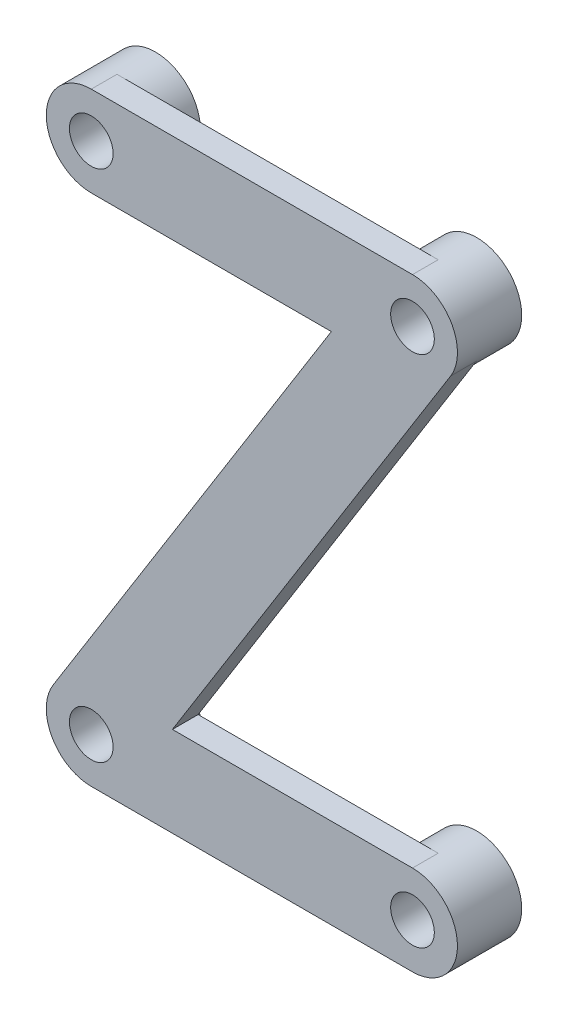
ISO-10303-21;
HEADER;
FILE_DESCRIPTION(('STEP AP214'),'2;1');
FILE_NAME('part.step','',(''),(''),'','','');
FILE_SCHEMA(('AUTOMOTIVE_DESIGN { 1 0 10303 214 1 1 1 1 }'));
ENDSEC;
DATA;
#1=APPLICATION_CONTEXT('core data for automotive mechanical design processes');
#2=APPLICATION_PROTOCOL_DEFINITION('international standard','automotive_design',2000,#1);
#3=PRODUCT_CONTEXT('',#1,'mechanical');
#4=PRODUCT('Part','Part','',(#3));
#5=PRODUCT_RELATED_PRODUCT_CATEGORY('part','',(#4));
#6=PRODUCT_DEFINITION_FORMATION('','',#4);
#7=PRODUCT_DEFINITION_CONTEXT('part definition',#1,'design');
#8=PRODUCT_DEFINITION('design','',#6,#7);
#9=PRODUCT_DEFINITION_SHAPE('','',#8);
#10=(LENGTH_UNIT() NAMED_UNIT(*) SI_UNIT(.MILLI.,.METRE.));
#11=(NAMED_UNIT(*) PLANE_ANGLE_UNIT() SI_UNIT($,.RADIAN.));
#12=(NAMED_UNIT(*) SI_UNIT($,.STERADIAN.) SOLID_ANGLE_UNIT());
#13=UNCERTAINTY_MEASURE_WITH_UNIT(LENGTH_MEASURE(1.E-05),#10,'distance_accuracy_value','');
#14=(GEOMETRIC_REPRESENTATION_CONTEXT(3) GLOBAL_UNCERTAINTY_ASSIGNED_CONTEXT((#13)) GLOBAL_UNIT_ASSIGNED_CONTEXT((#10,
#11,#12)) REPRESENTATION_CONTEXT('',''));
#15=CARTESIAN_POINT('',(0.,0.,0.));
#16=DIRECTION('',(0.,0.,1.));
#17=DIRECTION('',(1.,0.,0.));
#18=AXIS2_PLACEMENT_3D('',#15,#16,#17);
#19=CARTESIAN_POINT('',(0.,23.5,-2.));
#20=DIRECTION('',(0.,-1.,0.));
#21=DIRECTION('',(0.,0.,-1.));
#22=AXIS2_PLACEMENT_3D('',#19,#20,#21);
#23=PLANE('',#22);
#24=DIRECTION('',(1.,0.,0.));
#25=VECTOR('',#24,1.);
#26=CARTESIAN_POINT('',(0.,23.5,0.));
#27=LINE('',#26,#25);
#28=CARTESIAN_POINT('',(-12.5,23.5,0.));
#29=VERTEX_POINT('',#28);
#30=CARTESIAN_POINT('',(12.5,23.5,0.));
#31=VERTEX_POINT('',#30);
#32=EDGE_CURVE('E84',#29,#31,#27,.T.);
#33=ORIENTED_EDGE('',*,*,#32,.T.);
#34=DIRECTION('',(0.,0.,1.));
#35=VECTOR('',#34,1.);
#36=CARTESIAN_POINT('',(12.5,23.5,-2.));
#37=LINE('',#36,#35);
#38=CARTESIAN_POINT('',(12.5,23.5,-2.));
#39=VERTEX_POINT('',#38);
#40=EDGE_CURVE('E47',#39,#31,#37,.T.);
#41=ORIENTED_EDGE('',*,*,#40,.F.);
#42=DIRECTION('',(1.,0.,0.));
#43=VECTOR('',#42,1.);
#44=CARTESIAN_POINT('',(0.,23.5,-2.));
#45=LINE('',#44,#43);
#46=CARTESIAN_POINT('',(-12.5,23.5,-2.));
#47=VERTEX_POINT('',#46);
#48=EDGE_CURVE('E55',#47,#39,#45,.T.);
#49=ORIENTED_EDGE('',*,*,#48,.F.);
#50=DIRECTION('',(0.,0.,1.));
#51=VECTOR('',#50,1.);
#52=CARTESIAN_POINT('',(-12.5,23.5,-2.));
#53=LINE('',#52,#51);
#54=EDGE_CURVE('E11',#47,#29,#53,.T.);
#55=ORIENTED_EDGE('',*,*,#54,.T.);
#56=EDGE_LOOP('',(#33,#41,#49,#55));
#57=FACE_BOUND('',#56,.T.);
#58=ADVANCED_FACE('F37',(#57),#23,.F.);
#59=CARTESIAN_POINT('',(2.96799406401782,-1.85499629001114,-2.));
#60=DIRECTION('',(-0.847998304005088,0.52999894000318,0.));
#61=DIRECTION('',(-0.52999894000318,-0.847998304005088,0.));
#62=AXIS2_PLACEMENT_3D('',#59,#60,#61);
#63=PLANE('',#62);
#64=DIRECTION('',(-0.52999894000318,-0.847998304005088,0.));
#65=VECTOR('',#64,1.);
#66=CARTESIAN_POINT('',(2.96799406401782,-1.85499629001114,0.));
#67=LINE('',#66,#65);
#68=CARTESIAN_POINT('',(15.4679940640178,18.1450037099889,0.));
#69=VERTEX_POINT('',#68);
#70=CARTESIAN_POINT('',(-6.18513325472522,-16.5,0.));
#71=VERTEX_POINT('',#70);
#72=EDGE_CURVE('E79',#69,#71,#67,.T.);
#73=ORIENTED_EDGE('',*,*,#72,.T.);
#74=DIRECTION('',(0.,0.,1.));
#75=VECTOR('',#74,1.);
#76=CARTESIAN_POINT('',(-6.18513325472522,-16.5,-2.));
#77=LINE('',#76,#75);
#78=CARTESIAN_POINT('',(-6.18513325472522,-16.5,-2.));
#79=VERTEX_POINT('',#78);
#80=EDGE_CURVE('E126',#79,#71,#77,.T.);
#81=ORIENTED_EDGE('',*,*,#80,.F.);
#82=DIRECTION('',(-0.52999894000318,-0.847998304005088,0.));
#83=VECTOR('',#82,1.);
#84=CARTESIAN_POINT('',(2.96799406401782,-1.85499629001114,-2.));
#85=LINE('',#84,#83);
#86=CARTESIAN_POINT('',(15.4679940640178,18.1450037099889,-2.));
#87=VERTEX_POINT('',#86);
#88=EDGE_CURVE('E118',#87,#79,#85,.T.);
#89=ORIENTED_EDGE('',*,*,#88,.F.);
#90=DIRECTION('',(0.,0.,1.));
#91=VECTOR('',#90,1.);
#92=CARTESIAN_POINT('',(15.4679940640178,18.1450037099889,-2.));
#93=LINE('',#92,#91);
#94=EDGE_CURVE('E124',#87,#69,#93,.T.);
#95=ORIENTED_EDGE('',*,*,#94,.T.);
#96=EDGE_LOOP('',(#73,#81,#89,#95));
#97=FACE_BOUND('',#96,.T.);
#98=ADVANCED_FACE('F122',(#97),#63,.F.);
#99=CARTESIAN_POINT('',(0.,-16.5,-2.));
#100=DIRECTION('',(0.,-1.,0.));
#101=DIRECTION('',(1.,0.,0.));
#102=AXIS2_PLACEMENT_3D('',#99,#100,#101);
#103=PLANE('',#102);
#104=DIRECTION('',(1.,0.,0.));
#105=VECTOR('',#104,1.);
#106=CARTESIAN_POINT('',(0.,-16.5,0.));
#107=LINE('',#106,#105);
#108=CARTESIAN_POINT('',(12.5,-16.5,0.));
#109=VERTEX_POINT('',#108);
#110=EDGE_CURVE('E167',#71,#109,#107,.T.);
#111=ORIENTED_EDGE('',*,*,#110,.T.);
#112=DIRECTION('',(0.,0.,1.));
#113=VECTOR('',#112,1.);
#114=CARTESIAN_POINT('',(12.5,-16.5,-2.));
#115=LINE('',#114,#113);
#116=CARTESIAN_POINT('',(12.5,-16.5,-2.));
#117=VERTEX_POINT('',#116);
#118=EDGE_CURVE('E136',#117,#109,#115,.T.);
#119=ORIENTED_EDGE('',*,*,#118,.F.);
#120=DIRECTION('',(1.,0.,0.));
#121=VECTOR('',#120,1.);
#122=CARTESIAN_POINT('',(0.,-16.5,-2.));
#123=LINE('',#122,#121);
#124=EDGE_CURVE('E128',#79,#117,#123,.T.);
#125=ORIENTED_EDGE('',*,*,#124,.F.);
#126=ORIENTED_EDGE('',*,*,#80,.T.);
#127=EDGE_LOOP('',(#111,#119,#125,#126));
#128=FACE_BOUND('',#127,.T.);
#129=ADVANCED_FACE('F193',(#128),#103,.F.);
#130=CARTESIAN_POINT('',(0.,-23.5,-2.));
#131=DIRECTION('',(0.,-1.,0.));
#132=DIRECTION('',(0.,0.,-1.));
#133=AXIS2_PLACEMENT_3D('',#130,#131,#132);
#134=PLANE('',#133);
#135=DIRECTION('',(1.,0.,0.));
#136=VECTOR('',#135,1.);
#137=CARTESIAN_POINT('',(0.,-23.5,0.));
#138=LINE('',#137,#136);
#139=CARTESIAN_POINT('',(-12.5,-23.5,0.));
#140=VERTEX_POINT('',#139);
#141=CARTESIAN_POINT('',(12.5,-23.5,0.));
#142=VERTEX_POINT('',#141);
#143=EDGE_CURVE('E164',#140,#142,#138,.T.);
#144=ORIENTED_EDGE('',*,*,#143,.F.);
#145=DIRECTION('',(0.,0.,1.));
#146=VECTOR('',#145,1.);
#147=CARTESIAN_POINT('',(-12.5,-23.5,-2.));
#148=LINE('',#147,#146);
#149=CARTESIAN_POINT('',(-12.5,-23.5,-2.));
#150=VERTEX_POINT('',#149);
#151=EDGE_CURVE('E144',#150,#140,#148,.T.);
#152=ORIENTED_EDGE('',*,*,#151,.F.);
#153=DIRECTION('',(1.,0.,0.));
#154=VECTOR('',#153,1.);
#155=CARTESIAN_POINT('',(0.,-23.5,-2.));
#156=LINE('',#155,#154);
#157=CARTESIAN_POINT('',(12.5,-23.5,-2.));
#158=VERTEX_POINT('',#157);
#159=EDGE_CURVE('E184',#150,#158,#156,.T.);
#160=ORIENTED_EDGE('',*,*,#159,.T.);
#161=DIRECTION('',(0.,0.,1.));
#162=VECTOR('',#161,1.);
#163=CARTESIAN_POINT('',(12.5,-23.5,-2.));
#164=LINE('',#163,#162);
#165=EDGE_CURVE('E141',#158,#142,#164,.T.);
#166=ORIENTED_EDGE('',*,*,#165,.T.);
#167=EDGE_LOOP('',(#144,#152,#160,#166));
#168=FACE_BOUND('',#167,.T.);
#169=ADVANCED_FACE('F204',(#168),#134,.T.);
#170=CARTESIAN_POINT('',(-2.96799406401781,1.85499629001113,-2.));
#171=DIRECTION('',(-0.847998304005088,0.52999894000318,0.));
#172=DIRECTION('',(-0.52999894000318,-0.847998304005088,0.));
#173=AXIS2_PLACEMENT_3D('',#170,#171,#172);
#174=PLANE('',#173);
#175=DIRECTION('',(-0.52999894000318,-0.847998304005088,0.));
#176=VECTOR('',#175,1.);
#177=CARTESIAN_POINT('',(-2.96799406401781,1.85499629001113,0.));
#178=LINE('',#177,#176);
#179=CARTESIAN_POINT('',(6.18513325472523,16.5,0.));
#180=VERTEX_POINT('',#179);
#181=CARTESIAN_POINT('',(-15.4679940640178,-18.1450037099889,0.));
#182=VERTEX_POINT('',#181);
#183=EDGE_CURVE('E160',#180,#182,#178,.T.);
#184=ORIENTED_EDGE('',*,*,#183,.F.);
#185=DIRECTION('',(0.,0.,1.));
#186=VECTOR('',#185,1.);
#187=CARTESIAN_POINT('',(6.18513325472523,16.5,-2.));
#188=LINE('',#187,#186);
#189=CARTESIAN_POINT('',(6.18513325472523,16.5,-2.));
#190=VERTEX_POINT('',#189);
#191=EDGE_CURVE('E149',#190,#180,#188,.T.);
#192=ORIENTED_EDGE('',*,*,#191,.F.);
#193=DIRECTION('',(-0.52999894000318,-0.847998304005088,0.));
#194=VECTOR('',#193,1.);
#195=CARTESIAN_POINT('',(-2.96799406401781,1.85499629001113,-2.));
#196=LINE('',#195,#194);
#197=CARTESIAN_POINT('',(-15.4679940640178,-18.1450037099889,-2.));
#198=VERTEX_POINT('',#197);
#199=EDGE_CURVE('E174',#190,#198,#196,.T.);
#200=ORIENTED_EDGE('',*,*,#199,.T.);
#201=DIRECTION('',(0.,0.,1.));
#202=VECTOR('',#201,1.);
#203=CARTESIAN_POINT('',(-15.4679940640178,-18.1450037099889,-2.));
#204=LINE('',#203,#202);
#205=EDGE_CURVE('E147',#198,#182,#204,.T.);
#206=ORIENTED_EDGE('',*,*,#205,.T.);
#207=EDGE_LOOP('',(#184,#192,#200,#206));
#208=FACE_BOUND('',#207,.T.);
#209=ADVANCED_FACE('F285',(#208),#174,.T.);
#210=CARTESIAN_POINT('',(0.,16.5,-2.));
#211=DIRECTION('',(0.,-1.,0.));
#212=DIRECTION('',(1.,0.,0.));
#213=AXIS2_PLACEMENT_3D('',#210,#211,#212);
#214=PLANE('',#213);
#215=DIRECTION('',(1.,0.,0.));
#216=VECTOR('',#215,1.);
#217=CARTESIAN_POINT('',(0.,16.5,0.));
#218=LINE('',#217,#216);
#219=CARTESIAN_POINT('',(-12.5,16.5,0.));
#220=VERTEX_POINT('',#219);
#221=EDGE_CURVE('E157',#220,#180,#218,.T.);
#222=ORIENTED_EDGE('',*,*,#221,.F.);
#223=DIRECTION('',(0.,0.,1.));
#224=VECTOR('',#223,1.);
#225=CARTESIAN_POINT('',(-12.5,16.5,-2.));
#226=LINE('',#225,#224);
#227=CARTESIAN_POINT('',(-12.5,16.5,-2.));
#228=VERTEX_POINT('',#227);
#229=EDGE_CURVE('E41',#228,#220,#226,.T.);
#230=ORIENTED_EDGE('',*,*,#229,.F.);
#231=DIRECTION('',(1.,0.,0.));
#232=VECTOR('',#231,1.);
#233=CARTESIAN_POINT('',(0.,16.5,-2.));
#234=LINE('',#233,#232);
#235=EDGE_CURVE('E171',#228,#190,#234,.T.);
#236=ORIENTED_EDGE('',*,*,#235,.T.);
#237=ORIENTED_EDGE('',*,*,#191,.T.);
#238=EDGE_LOOP('',(#222,#230,#236,#237));
#239=FACE_BOUND('',#238,.T.);
#240=ADVANCED_FACE('F39',(#239),#214,.T.);
#241=CARTESIAN_POINT('',(0.,0.,-2.));
#242=DIRECTION('',(0.,0.,1.));
#243=DIRECTION('',(1.,0.,0.));
#244=AXIS2_PLACEMENT_3D('',#241,#242,#243);
#245=PLANE('',#244);
#246=CARTESIAN_POINT('',(-12.5,20.,-2.));
#247=DIRECTION('',(0.,0.,1.));
#248=DIRECTION('',(1.,0.,0.));
#249=AXIS2_PLACEMENT_3D('',#246,#247,#248);
#250=CIRCLE('',#249,3.5);
#251=EDGE_CURVE('E170',#228,#47,#250,.T.);
#252=ORIENTED_EDGE('',*,*,#251,.T.);
#253=ORIENTED_EDGE('',*,*,#48,.T.);
#254=CARTESIAN_POINT('',(12.5,20.,-2.));
#255=DIRECTION('',(0.,0.,1.));
#256=DIRECTION('',(1.,0.,0.));
#257=AXIS2_PLACEMENT_3D('',#254,#255,#256);
#258=CIRCLE('',#257,3.50000000000001);
#259=EDGE_CURVE('E115',#39,#87,#258,.T.);
#260=ORIENTED_EDGE('',*,*,#259,.T.);
#261=ORIENTED_EDGE('',*,*,#88,.T.);
#262=ORIENTED_EDGE('',*,*,#124,.T.);
#263=CARTESIAN_POINT('',(12.5,-20.,-2.));
#264=DIRECTION('',(0.,0.,1.));
#265=DIRECTION('',(1.,0.,0.));
#266=AXIS2_PLACEMENT_3D('',#263,#264,#265);
#267=CIRCLE('',#266,3.49999999999999);
#268=EDGE_CURVE('E187',#117,#158,#267,.T.);
#269=ORIENTED_EDGE('',*,*,#268,.T.);
#270=ORIENTED_EDGE('',*,*,#159,.F.);
#271=CARTESIAN_POINT('',(-12.5,-20.,-2.));
#272=DIRECTION('',(0.,0.,1.));
#273=DIRECTION('',(1.,0.,0.));
#274=AXIS2_PLACEMENT_3D('',#271,#272,#273);
#275=CIRCLE('',#274,3.5);
#276=EDGE_CURVE('E182',#150,#198,#275,.T.);
#277=ORIENTED_EDGE('',*,*,#276,.T.);
#278=ORIENTED_EDGE('',*,*,#199,.F.);
#279=ORIENTED_EDGE('',*,*,#235,.F.);
#280=EDGE_LOOP('',(#252,#253,#260,#261,#262,#269,#270,#277,#278,#279));
#281=FACE_BOUND('',#280,.T.);
#282=ADVANCED_FACE('F117',(#281),#245,.F.);
#283=CARTESIAN_POINT('',(0.,0.,0.));
#284=DIRECTION('',(0.,0.,1.));
#285=DIRECTION('',(1.,0.,0.));
#286=AXIS2_PLACEMENT_3D('',#283,#284,#285);
#287=PLANE('',#286);
#288=ORIENTED_EDGE('',*,*,#32,.F.);
#289=CARTESIAN_POINT('',(-12.5,20.,0.));
#290=DIRECTION('',(0.,0.,1.));
#291=DIRECTION('',(1.,0.,0.));
#292=AXIS2_PLACEMENT_3D('',#289,#290,#291);
#293=CIRCLE('',#292,3.5);
#294=EDGE_CURVE('E177',#29,#220,#293,.T.);
#295=ORIENTED_EDGE('',*,*,#294,.T.);
#296=ORIENTED_EDGE('',*,*,#221,.T.);
#297=ORIENTED_EDGE('',*,*,#183,.T.);
#298=CARTESIAN_POINT('',(-12.5,-20.,0.));
#299=DIRECTION('',(0.,0.,1.));
#300=DIRECTION('',(1.,0.,0.));
#301=AXIS2_PLACEMENT_3D('',#298,#299,#300);
#302=CIRCLE('',#301,3.5);
#303=EDGE_CURVE('E234',#182,#140,#302,.T.);
#304=ORIENTED_EDGE('',*,*,#303,.T.);
#305=ORIENTED_EDGE('',*,*,#143,.T.);
#306=CARTESIAN_POINT('',(12.5,-20.,0.));
#307=DIRECTION('',(0.,0.,1.));
#308=DIRECTION('',(1.,0.,0.));
#309=AXIS2_PLACEMENT_3D('',#306,#307,#308);
#310=CIRCLE('',#309,3.49999999999999);
#311=EDGE_CURVE('E202',#142,#109,#310,.T.);
#312=ORIENTED_EDGE('',*,*,#311,.T.);
#313=ORIENTED_EDGE('',*,*,#110,.F.);
#314=ORIENTED_EDGE('',*,*,#72,.F.);
#315=CARTESIAN_POINT('',(12.5,20.,0.));
#316=DIRECTION('',(0.,0.,1.));
#317=DIRECTION('',(1.,0.,0.));
#318=AXIS2_PLACEMENT_3D('',#315,#316,#317);
#319=CIRCLE('',#318,3.50000000000001);
#320=EDGE_CURVE('E133',#69,#31,#319,.T.);
#321=ORIENTED_EDGE('',*,*,#320,.T.);
#322=EDGE_LOOP('',(#288,#295,#296,#297,#304,#305,#312,#313,#314,#321));
#323=FACE_BOUND('',#322,.T.);
#324=CARTESIAN_POINT('',(-12.5,20.,0.));
#325=DIRECTION('',(0.,0.,1.));
#326=DIRECTION('',(1.,0.,0.));
#327=AXIS2_PLACEMENT_3D('',#324,#325,#326);
#328=CIRCLE('',#327,1.7);
#329=CARTESIAN_POINT('',(-10.8,20.,0.));
#330=VERTEX_POINT('',#329);
#331=EDGE_CURVE('E214',#330,#330,#328,.T.);
#332=ORIENTED_EDGE('',*,*,#331,.F.);
#333=EDGE_LOOP('',(#332));
#334=FACE_BOUND('',#333,.T.);
#335=CARTESIAN_POINT('',(12.5,20.,0.));
#336=DIRECTION('',(0.,0.,1.));
#337=DIRECTION('',(1.,0.,0.));
#338=AXIS2_PLACEMENT_3D('',#335,#336,#337);
#339=CIRCLE('',#338,1.7);
#340=CARTESIAN_POINT('',(14.2,20.,0.));
#341=VERTEX_POINT('',#340);
#342=EDGE_CURVE('E228',#341,#341,#339,.T.);
#343=ORIENTED_EDGE('',*,*,#342,.F.);
#344=EDGE_LOOP('',(#343));
#345=FACE_BOUND('',#344,.T.);
#346=CARTESIAN_POINT('',(-12.5,-20.,0.));
#347=DIRECTION('',(0.,0.,1.));
#348=DIRECTION('',(1.,0.,0.));
#349=AXIS2_PLACEMENT_3D('',#346,#347,#348);
#350=CIRCLE('',#349,1.7);
#351=CARTESIAN_POINT('',(-10.8,-20.,0.));
#352=VERTEX_POINT('',#351);
#353=EDGE_CURVE('E237',#352,#352,#350,.T.);
#354=ORIENTED_EDGE('',*,*,#353,.F.);
#355=EDGE_LOOP('',(#354));
#356=FACE_BOUND('',#355,.T.);
#357=CARTESIAN_POINT('',(12.5,-20.,0.));
#358=DIRECTION('',(0.,0.,1.));
#359=DIRECTION('',(1.,0.,0.));
#360=AXIS2_PLACEMENT_3D('',#357,#358,#359);
#361=CIRCLE('',#360,1.7);
#362=CARTESIAN_POINT('',(14.2,-20.,0.));
#363=VERTEX_POINT('',#362);
#364=EDGE_CURVE('E247',#363,#363,#361,.T.);
#365=ORIENTED_EDGE('',*,*,#364,.F.);
#366=EDGE_LOOP('',(#365));
#367=FACE_BOUND('',#366,.T.);
#368=ADVANCED_FACE('F210',(#323,#334,#345,#356,#367),#287,.T.);
#369=CARTESIAN_POINT('',(-12.5,20.,-5.));
#370=DIRECTION('',(0.,0.,1.));
#371=DIRECTION('',(1.,0.,0.));
#372=AXIS2_PLACEMENT_3D('',#369,#370,#371);
#373=CYLINDRICAL_SURFACE('',#372,3.5);
#374=CARTESIAN_POINT('',(-12.5,20.,-5.));
#375=DIRECTION('',(0.,0.,1.));
#376=DIRECTION('',(1.,0.,0.));
#377=AXIS2_PLACEMENT_3D('',#374,#375,#376);
#378=CIRCLE('',#377,3.5);
#379=CARTESIAN_POINT('',(-9.,20.,-5.));
#380=VERTEX_POINT('',#379);
#381=EDGE_CURVE('E161',#380,#380,#378,.T.);
#382=ORIENTED_EDGE('',*,*,#381,.T.);
#383=EDGE_LOOP('',(#382));
#384=FACE_BOUND('',#383,.T.);
#385=ORIENTED_EDGE('',*,*,#54,.F.);
#386=ORIENTED_EDGE('',*,*,#251,.F.);
#387=ORIENTED_EDGE('',*,*,#229,.T.);
#388=ORIENTED_EDGE('',*,*,#294,.F.);
#389=EDGE_LOOP('',(#385,#386,#387,#388));
#390=FACE_BOUND('',#389,.T.);
#391=ADVANCED_FACE('F212',(#384,#390),#373,.T.);
#392=CARTESIAN_POINT('',(-12.5,20.,-5.));
#393=DIRECTION('',(0.,0.,1.));
#394=DIRECTION('',(1.,0.,0.));
#395=AXIS2_PLACEMENT_3D('',#392,#393,#394);
#396=CYLINDRICAL_SURFACE('',#395,1.7);
#397=CARTESIAN_POINT('',(-12.5,20.,-5.));
#398=DIRECTION('',(0.,0.,1.));
#399=DIRECTION('',(1.,0.,0.));
#400=AXIS2_PLACEMENT_3D('',#397,#398,#399);
#401=CIRCLE('',#400,1.7);
#402=CARTESIAN_POINT('',(-10.8,20.,-5.));
#403=VERTEX_POINT('',#402);
#404=EDGE_CURVE('E213',#403,#403,#401,.T.);
#405=ORIENTED_EDGE('',*,*,#404,.F.);
#406=EDGE_LOOP('',(#405));
#407=FACE_BOUND('',#406,.T.);
#408=ORIENTED_EDGE('',*,*,#331,.T.);
#409=EDGE_LOOP('',(#408));
#410=FACE_BOUND('',#409,.T.);
#411=ADVANCED_FACE('F271',(#407,#410),#396,.F.);
#412=CARTESIAN_POINT('',(0.,0.,-5.));
#413=DIRECTION('',(0.,0.,1.));
#414=DIRECTION('',(1.,0.,0.));
#415=AXIS2_PLACEMENT_3D('',#412,#413,#414);
#416=PLANE('',#415);
#417=ORIENTED_EDGE('',*,*,#404,.T.);
#418=EDGE_LOOP('',(#417));
#419=FACE_BOUND('',#418,.T.);
#420=ORIENTED_EDGE('',*,*,#381,.F.);
#421=EDGE_LOOP('',(#420));
#422=FACE_BOUND('',#421,.T.);
#423=ADVANCED_FACE('F322',(#419,#422),#416,.F.);
#424=CARTESIAN_POINT('',(12.5,20.,-5.));
#425=DIRECTION('',(0.,0.,1.));
#426=DIRECTION('',(1.,0.,0.));
#427=AXIS2_PLACEMENT_3D('',#424,#425,#426);
#428=CYLINDRICAL_SURFACE('',#427,1.7);
#429=CARTESIAN_POINT('',(12.5,20.,-5.));
#430=DIRECTION('',(0.,0.,1.));
#431=DIRECTION('',(1.,0.,0.));
#432=AXIS2_PLACEMENT_3D('',#429,#430,#431);
#433=CIRCLE('',#432,1.7);
#434=CARTESIAN_POINT('',(14.2,20.,-5.));
#435=VERTEX_POINT('',#434);
#436=EDGE_CURVE('E222',#435,#435,#433,.T.);
#437=ORIENTED_EDGE('',*,*,#436,.F.);
#438=EDGE_LOOP('',(#437));
#439=FACE_BOUND('',#438,.T.);
#440=ORIENTED_EDGE('',*,*,#342,.T.);
#441=EDGE_LOOP('',(#440));
#442=FACE_BOUND('',#441,.T.);
#443=ADVANCED_FACE('F319',(#439,#442),#428,.F.);
#444=CARTESIAN_POINT('',(12.5,20.,-5.));
#445=DIRECTION('',(0.,0.,1.));
#446=DIRECTION('',(1.,0.,0.));
#447=AXIS2_PLACEMENT_3D('',#444,#445,#446);
#448=CYLINDRICAL_SURFACE('',#447,3.50000000000001);
#449=ORIENTED_EDGE('',*,*,#259,.F.);
#450=ORIENTED_EDGE('',*,*,#40,.T.);
#451=ORIENTED_EDGE('',*,*,#320,.F.);
#452=ORIENTED_EDGE('',*,*,#94,.F.);
#453=EDGE_LOOP('',(#449,#450,#451,#452));
#454=FACE_BOUND('',#453,.T.);
#455=CARTESIAN_POINT('',(12.5,20.,-5.));
#456=DIRECTION('',(0.,0.,1.));
#457=DIRECTION('',(1.,0.,0.));
#458=AXIS2_PLACEMENT_3D('',#455,#456,#457);
#459=CIRCLE('',#458,3.50000000000001);
#460=CARTESIAN_POINT('',(16.,20.,-5.));
#461=VERTEX_POINT('',#460);
#462=EDGE_CURVE('E218',#461,#461,#459,.T.);
#463=ORIENTED_EDGE('',*,*,#462,.T.);
#464=EDGE_LOOP('',(#463));
#465=FACE_BOUND('',#464,.T.);
#466=ADVANCED_FACE('F130',(#454,#465),#448,.T.);
#467=CARTESIAN_POINT('',(0.,0.,-5.));
#468=DIRECTION('',(0.,0.,1.));
#469=DIRECTION('',(1.,0.,0.));
#470=AXIS2_PLACEMENT_3D('',#467,#468,#469);
#471=PLANE('',#470);
#472=ORIENTED_EDGE('',*,*,#436,.T.);
#473=EDGE_LOOP('',(#472));
#474=FACE_BOUND('',#473,.T.);
#475=ORIENTED_EDGE('',*,*,#462,.F.);
#476=EDGE_LOOP('',(#475));
#477=FACE_BOUND('',#476,.T.);
#478=ADVANCED_FACE('F312',(#474,#477),#471,.F.);
#479=CARTESIAN_POINT('',(-12.5,-20.,-5.));
#480=DIRECTION('',(0.,0.,1.));
#481=DIRECTION('',(1.,0.,0.));
#482=AXIS2_PLACEMENT_3D('',#479,#480,#481);
#483=CYLINDRICAL_SURFACE('',#482,1.7);
#484=CARTESIAN_POINT('',(-12.5,-20.,-5.));
#485=DIRECTION('',(0.,0.,1.));
#486=DIRECTION('',(1.,0.,0.));
#487=AXIS2_PLACEMENT_3D('',#484,#485,#486);
#488=CIRCLE('',#487,1.7);
#489=CARTESIAN_POINT('',(-10.8,-20.,-5.));
#490=VERTEX_POINT('',#489);
#491=EDGE_CURVE('E236',#490,#490,#488,.T.);
#492=ORIENTED_EDGE('',*,*,#491,.F.);
#493=EDGE_LOOP('',(#492));
#494=FACE_BOUND('',#493,.T.);
#495=ORIENTED_EDGE('',*,*,#353,.T.);
#496=EDGE_LOOP('',(#495));
#497=FACE_BOUND('',#496,.T.);
#498=ADVANCED_FACE('F299',(#494,#497),#483,.F.);
#499=CARTESIAN_POINT('',(-12.5,-20.,-5.));
#500=DIRECTION('',(0.,0.,1.));
#501=DIRECTION('',(1.,0.,0.));
#502=AXIS2_PLACEMENT_3D('',#499,#500,#501);
#503=CYLINDRICAL_SURFACE('',#502,3.5);
#504=ORIENTED_EDGE('',*,*,#276,.F.);
#505=ORIENTED_EDGE('',*,*,#151,.T.);
#506=ORIENTED_EDGE('',*,*,#303,.F.);
#507=ORIENTED_EDGE('',*,*,#205,.F.);
#508=EDGE_LOOP('',(#504,#505,#506,#507));
#509=FACE_BOUND('',#508,.T.);
#510=CARTESIAN_POINT('',(-12.5,-20.,-5.));
#511=DIRECTION('',(0.,0.,1.));
#512=DIRECTION('',(1.,0.,0.));
#513=AXIS2_PLACEMENT_3D('',#510,#511,#512);
#514=CIRCLE('',#513,3.5);
#515=CARTESIAN_POINT('',(-8.99999999999999,-20.,-5.));
#516=VERTEX_POINT('',#515);
#517=EDGE_CURVE('E230',#516,#516,#514,.T.);
#518=ORIENTED_EDGE('',*,*,#517,.T.);
#519=EDGE_LOOP('',(#518));
#520=FACE_BOUND('',#519,.T.);
#521=ADVANCED_FACE('F296',(#509,#520),#503,.T.);
#522=CARTESIAN_POINT('',(0.,0.,-5.));
#523=DIRECTION('',(0.,0.,1.));
#524=DIRECTION('',(1.,0.,0.));
#525=AXIS2_PLACEMENT_3D('',#522,#523,#524);
#526=PLANE('',#525);
#527=ORIENTED_EDGE('',*,*,#491,.T.);
#528=EDGE_LOOP('',(#527));
#529=FACE_BOUND('',#528,.T.);
#530=ORIENTED_EDGE('',*,*,#517,.F.);
#531=EDGE_LOOP('',(#530));
#532=FACE_BOUND('',#531,.T.);
#533=ADVANCED_FACE('F261',(#529,#532),#526,.F.);
#534=CARTESIAN_POINT('',(12.5,-20.,-5.));
#535=DIRECTION('',(0.,0.,1.));
#536=DIRECTION('',(1.,0.,0.));
#537=AXIS2_PLACEMENT_3D('',#534,#535,#536);
#538=CYLINDRICAL_SURFACE('',#537,1.7);
#539=CARTESIAN_POINT('',(12.5,-20.,-5.));
#540=DIRECTION('',(0.,0.,1.));
#541=DIRECTION('',(1.,0.,0.));
#542=AXIS2_PLACEMENT_3D('',#539,#540,#541);
#543=CIRCLE('',#542,1.7);
#544=CARTESIAN_POINT('',(14.2,-20.,-5.));
#545=VERTEX_POINT('',#544);
#546=EDGE_CURVE('E246',#545,#545,#543,.T.);
#547=ORIENTED_EDGE('',*,*,#546,.F.);
#548=EDGE_LOOP('',(#547));
#549=FACE_BOUND('',#548,.T.);
#550=ORIENTED_EDGE('',*,*,#364,.T.);
#551=EDGE_LOOP('',(#550));
#552=FACE_BOUND('',#551,.T.);
#553=ADVANCED_FACE('F258',(#549,#552),#538,.F.);
#554=CARTESIAN_POINT('',(12.5,-20.,-5.));
#555=DIRECTION('',(0.,0.,1.));
#556=DIRECTION('',(1.,0.,0.));
#557=AXIS2_PLACEMENT_3D('',#554,#555,#556);
#558=CYLINDRICAL_SURFACE('',#557,3.49999999999999);
#559=ORIENTED_EDGE('',*,*,#268,.F.);
#560=ORIENTED_EDGE('',*,*,#118,.T.);
#561=ORIENTED_EDGE('',*,*,#311,.F.);
#562=ORIENTED_EDGE('',*,*,#165,.F.);
#563=EDGE_LOOP('',(#559,#560,#561,#562));
#564=FACE_BOUND('',#563,.T.);
#565=CARTESIAN_POINT('',(12.5,-20.,-5.));
#566=DIRECTION('',(0.,0.,1.));
#567=DIRECTION('',(1.,0.,0.));
#568=AXIS2_PLACEMENT_3D('',#565,#566,#567);
#569=CIRCLE('',#568,3.49999999999999);
#570=CARTESIAN_POINT('',(16.,-20.,-5.));
#571=VERTEX_POINT('',#570);
#572=EDGE_CURVE('E240',#571,#571,#569,.T.);
#573=ORIENTED_EDGE('',*,*,#572,.T.);
#574=EDGE_LOOP('',(#573));
#575=FACE_BOUND('',#574,.T.);
#576=ADVANCED_FACE('F199',(#564,#575),#558,.T.);
#577=CARTESIAN_POINT('',(0.,0.,-5.));
#578=DIRECTION('',(0.,0.,1.));
#579=DIRECTION('',(1.,0.,0.));
#580=AXIS2_PLACEMENT_3D('',#577,#578,#579);
#581=PLANE('',#580);
#582=ORIENTED_EDGE('',*,*,#546,.T.);
#583=EDGE_LOOP('',(#582));
#584=FACE_BOUND('',#583,.T.);
#585=ORIENTED_EDGE('',*,*,#572,.F.);
#586=EDGE_LOOP('',(#585));
#587=FACE_BOUND('',#586,.T.);
#588=ADVANCED_FACE('F255',(#584,#587),#581,.F.);
#589=CLOSED_SHELL('',(#58,#98,#129,#169,#209,#240,#282,#368,#391,#411,#423,#443,#466,#478,#498,
#521,#533,#553,#576,#588));
#590=MANIFOLD_SOLID_BREP('B2',#589);
#591=ADVANCED_BREP_SHAPE_REPRESENTATION('',(#18,#590),#14);
#592=SHAPE_DEFINITION_REPRESENTATION(#9,#591);
ENDSEC;
END-ISO-10303-21;
